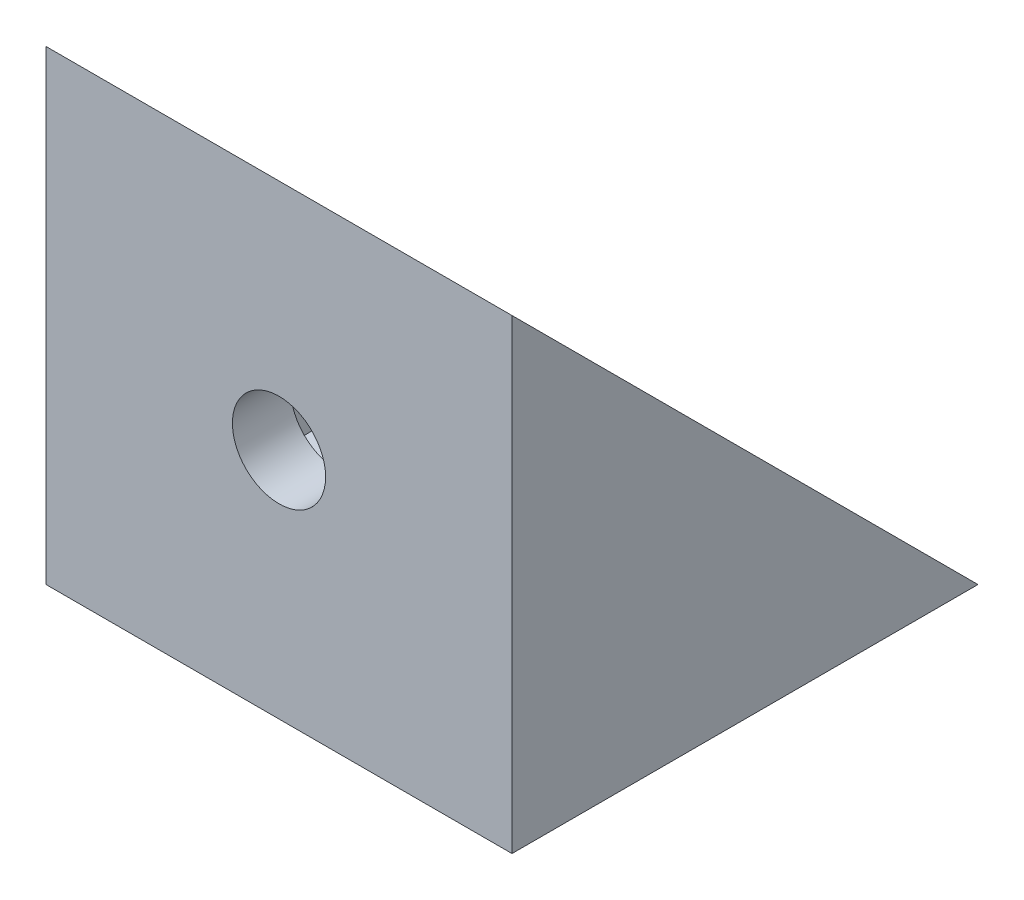
ISO-10303-21;
HEADER;
FILE_DESCRIPTION(('STEP AP214'),'2;1');
FILE_NAME('part.step','',(''),(''),'','','');
FILE_SCHEMA(('AUTOMOTIVE_DESIGN { 1 0 10303 214 1 1 1 1 }'));
ENDSEC;
DATA;
#1=APPLICATION_CONTEXT('core data for automotive mechanical design processes');
#2=APPLICATION_PROTOCOL_DEFINITION('international standard','automotive_design',2000,#1);
#3=PRODUCT_CONTEXT('',#1,'mechanical');
#4=PRODUCT('Part','Part','',(#3));
#5=PRODUCT_RELATED_PRODUCT_CATEGORY('part','',(#4));
#6=PRODUCT_DEFINITION_FORMATION('','',#4);
#7=PRODUCT_DEFINITION_CONTEXT('part definition',#1,'design');
#8=PRODUCT_DEFINITION('design','',#6,#7);
#9=PRODUCT_DEFINITION_SHAPE('','',#8);
#10=(LENGTH_UNIT() NAMED_UNIT(*) SI_UNIT(.MILLI.,.METRE.));
#11=(NAMED_UNIT(*) PLANE_ANGLE_UNIT() SI_UNIT($,.RADIAN.));
#12=(NAMED_UNIT(*) SI_UNIT($,.STERADIAN.) SOLID_ANGLE_UNIT());
#13=UNCERTAINTY_MEASURE_WITH_UNIT(LENGTH_MEASURE(1.E-05),#10,'distance_accuracy_value','');
#14=(GEOMETRIC_REPRESENTATION_CONTEXT(3) GLOBAL_UNCERTAINTY_ASSIGNED_CONTEXT((#13)) GLOBAL_UNIT_ASSIGNED_CONTEXT((#10,
#11,#12)) REPRESENTATION_CONTEXT('',''));
#15=CARTESIAN_POINT('',(0.,0.,0.));
#16=DIRECTION('',(0.,0.,1.));
#17=DIRECTION('',(1.,0.,0.));
#18=AXIS2_PLACEMENT_3D('',#15,#16,#17);
#19=CARTESIAN_POINT('',(-20.,0.,-40.));
#20=DIRECTION('',(0.,-1.,0.));
#21=DIRECTION('',(0.,0.,-1.));
#22=AXIS2_PLACEMENT_3D('',#19,#20,#21);
#23=PLANE('',#22);
#24=CARTESIAN_POINT('',(0.,0.,-20.));
#25=DIRECTION('',(0.,-1.,0.));
#26=DIRECTION('',(0.,0.,-1.));
#27=AXIS2_PLACEMENT_3D('',#24,#25,#26);
#28=CIRCLE('',#27,4.);
#29=CARTESIAN_POINT('',(0.,0.,-24.));
#30=VERTEX_POINT('',#29);
#31=EDGE_CURVE('E154',#30,#30,#28,.T.);
#32=ORIENTED_EDGE('',*,*,#31,.F.);
#33=EDGE_LOOP('',(#32));
#34=FACE_BOUND('',#33,.T.);
#35=DIRECTION('',(1.,0.,0.));
#36=VECTOR('',#35,1.);
#37=CARTESIAN_POINT('',(-20.,0.,-40.));
#38=LINE('',#37,#36);
#39=CARTESIAN_POINT('',(-20.,0.,-40.));
#40=VERTEX_POINT('',#39);
#41=CARTESIAN_POINT('',(20.,0.,-40.));
#42=VERTEX_POINT('',#41);
#43=EDGE_CURVE('E37',#40,#42,#38,.T.);
#44=ORIENTED_EDGE('',*,*,#43,.T.);
#45=DIRECTION('',(0.,0.,-1.));
#46=VECTOR('',#45,1.);
#47=CARTESIAN_POINT('',(20.,0.,-40.));
#48=LINE('',#47,#46);
#49=CARTESIAN_POINT('',(20.,0.,0.));
#50=VERTEX_POINT('',#49);
#51=EDGE_CURVE('E107',#50,#42,#48,.T.);
#52=ORIENTED_EDGE('',*,*,#51,.F.);
#53=DIRECTION('',(1.,0.,0.));
#54=VECTOR('',#53,1.);
#55=CARTESIAN_POINT('',(-20.,0.,0.));
#56=LINE('',#55,#54);
#57=CARTESIAN_POINT('',(-20.,0.,0.));
#58=VERTEX_POINT('',#57);
#59=EDGE_CURVE('E11',#58,#50,#56,.T.);
#60=ORIENTED_EDGE('',*,*,#59,.F.);
#61=DIRECTION('',(0.,0.,-1.));
#62=VECTOR('',#61,1.);
#63=CARTESIAN_POINT('',(-20.,0.,-40.));
#64=LINE('',#63,#62);
#65=EDGE_CURVE('E121',#58,#40,#64,.T.);
#66=ORIENTED_EDGE('',*,*,#65,.T.);
#67=EDGE_LOOP('',(#44,#52,#60,#66));
#68=FACE_BOUND('',#67,.T.);
#69=ADVANCED_FACE('F34',(#34,#68),#23,.T.);
#70=CARTESIAN_POINT('',(-20.,0.,0.));
#71=DIRECTION('',(0.,0.,1.));
#72=DIRECTION('',(1.,0.,0.));
#73=AXIS2_PLACEMENT_3D('',#70,#71,#72);
#74=PLANE('',#73);
#75=CARTESIAN_POINT('',(0.,20.,0.));
#76=DIRECTION('',(0.,0.,1.));
#77=DIRECTION('',(1.,0.,0.));
#78=AXIS2_PLACEMENT_3D('',#75,#76,#77);
#79=CIRCLE('',#78,4.);
#80=CARTESIAN_POINT('',(4.,20.,0.));
#81=VERTEX_POINT('',#80);
#82=EDGE_CURVE('E101',#81,#81,#79,.T.);
#83=ORIENTED_EDGE('',*,*,#82,.F.);
#84=EDGE_LOOP('',(#83));
#85=FACE_BOUND('',#84,.T.);
#86=ORIENTED_EDGE('',*,*,#59,.T.);
#87=DIRECTION('',(0.,-1.,0.));
#88=VECTOR('',#87,1.);
#89=CARTESIAN_POINT('',(20.,0.,0.));
#90=LINE('',#89,#88);
#91=CARTESIAN_POINT('',(20.,40.,0.));
#92=VERTEX_POINT('',#91);
#93=EDGE_CURVE('E118',#92,#50,#90,.T.);
#94=ORIENTED_EDGE('',*,*,#93,.F.);
#95=DIRECTION('',(1.,0.,0.));
#96=VECTOR('',#95,1.);
#97=CARTESIAN_POINT('',(-20.,40.,0.));
#98=LINE('',#97,#96);
#99=CARTESIAN_POINT('',(-20.,40.,0.));
#100=VERTEX_POINT('',#99);
#101=EDGE_CURVE('E42',#100,#92,#98,.T.);
#102=ORIENTED_EDGE('',*,*,#101,.F.);
#103=DIRECTION('',(0.,-1.,0.));
#104=VECTOR('',#103,1.);
#105=CARTESIAN_POINT('',(-20.,0.,0.));
#106=LINE('',#105,#104);
#107=EDGE_CURVE('E126',#100,#58,#106,.T.);
#108=ORIENTED_EDGE('',*,*,#107,.T.);
#109=EDGE_LOOP('',(#86,#94,#102,#108));
#110=FACE_BOUND('',#109,.T.);
#111=ADVANCED_FACE('F134',(#85,#110),#74,.T.);
#112=CARTESIAN_POINT('',(-20.,40.,0.));
#113=DIRECTION('',(0.,0.707106781186548,-0.707106781186548));
#114=DIRECTION('',(0.,0.707106781186548,0.707106781186548));
#115=AXIS2_PLACEMENT_3D('',#112,#113,#114);
#116=PLANE('',#115);
#117=DIRECTION('',(0.,0.707106781186547,0.707106781186547));
#118=VECTOR('',#117,1.);
#119=CARTESIAN_POINT('',(15.,5.,-35.));
#120=LINE('',#119,#118);
#121=CARTESIAN_POINT('',(15.,5.,-35.));
#122=VERTEX_POINT('',#121);
#123=CARTESIAN_POINT('',(15.,35.,-5.));
#124=VERTEX_POINT('',#123);
#125=EDGE_CURVE('E106',#122,#124,#120,.T.);
#126=ORIENTED_EDGE('',*,*,#125,.T.);
#127=DIRECTION('',(-1.,0.,0.));
#128=VECTOR('',#127,1.);
#129=CARTESIAN_POINT('',(15.,35.,-5.));
#130=LINE('',#129,#128);
#131=CARTESIAN_POINT('',(-15.,35.,-5.));
#132=VERTEX_POINT('',#131);
#133=EDGE_CURVE('E91',#124,#132,#130,.T.);
#134=ORIENTED_EDGE('',*,*,#133,.T.);
#135=DIRECTION('',(0.,0.707106781186547,0.707106781186547));
#136=VECTOR('',#135,1.);
#137=CARTESIAN_POINT('',(-15.,5.,-35.));
#138=LINE('',#137,#136);
#139=CARTESIAN_POINT('',(-15.,5.,-35.));
#140=VERTEX_POINT('',#139);
#141=EDGE_CURVE('E95',#140,#132,#138,.T.);
#142=ORIENTED_EDGE('',*,*,#141,.F.);
#143=DIRECTION('',(-1.,0.,0.));
#144=VECTOR('',#143,1.);
#145=CARTESIAN_POINT('',(15.,5.,-35.));
#146=LINE('',#145,#144);
#147=EDGE_CURVE('E112',#122,#140,#146,.T.);
#148=ORIENTED_EDGE('',*,*,#147,.F.);
#149=EDGE_LOOP('',(#126,#134,#142,#148));
#150=FACE_BOUND('',#149,.T.);
#151=ORIENTED_EDGE('',*,*,#101,.T.);
#152=DIRECTION('',(0.,0.707106781186548,0.707106781186548));
#153=VECTOR('',#152,1.);
#154=CARTESIAN_POINT('',(20.,40.,0.));
#155=LINE('',#154,#153);
#156=EDGE_CURVE('E110',#42,#92,#155,.T.);
#157=ORIENTED_EDGE('',*,*,#156,.F.);
#158=ORIENTED_EDGE('',*,*,#43,.F.);
#159=DIRECTION('',(0.,0.707106781186548,0.707106781186548));
#160=VECTOR('',#159,1.);
#161=CARTESIAN_POINT('',(-20.,40.,0.));
#162=LINE('',#161,#160);
#163=EDGE_CURVE('E123',#40,#100,#162,.T.);
#164=ORIENTED_EDGE('',*,*,#163,.T.);
#165=EDGE_LOOP('',(#151,#157,#158,#164));
#166=FACE_BOUND('',#165,.T.);
#167=ADVANCED_FACE('F103',(#150,#166),#116,.T.);
#168=CARTESIAN_POINT('',(-20.,0.,0.));
#169=DIRECTION('',(-1.,0.,0.));
#170=DIRECTION('',(0.,0.,1.));
#171=AXIS2_PLACEMENT_3D('',#168,#169,#170);
#172=PLANE('',#171);
#173=ORIENTED_EDGE('',*,*,#65,.F.);
#174=ORIENTED_EDGE('',*,*,#107,.F.);
#175=ORIENTED_EDGE('',*,*,#163,.F.);
#176=EDGE_LOOP('',(#173,#174,#175));
#177=FACE_BOUND('',#176,.T.);
#178=ADVANCED_FACE('F137',(#177),#172,.T.);
#179=CARTESIAN_POINT('',(20.,0.,0.));
#180=DIRECTION('',(-1.,0.,0.));
#181=DIRECTION('',(0.,0.,1.));
#182=AXIS2_PLACEMENT_3D('',#179,#180,#181);
#183=PLANE('',#182);
#184=ORIENTED_EDGE('',*,*,#51,.T.);
#185=ORIENTED_EDGE('',*,*,#156,.T.);
#186=ORIENTED_EDGE('',*,*,#93,.T.);
#187=EDGE_LOOP('',(#184,#185,#186));
#188=FACE_BOUND('',#187,.T.);
#189=ADVANCED_FACE('F132',(#188),#183,.F.);
#190=CARTESIAN_POINT('',(15.,35.,-5.));
#191=DIRECTION('',(0.,0.,-1.));
#192=DIRECTION('',(0.,1.,0.));
#193=AXIS2_PLACEMENT_3D('',#190,#191,#192);
#194=PLANE('',#193);
#195=CARTESIAN_POINT('',(0.,20.,-5.));
#196=DIRECTION('',(0.,0.,-1.));
#197=DIRECTION('',(0.,1.,0.));
#198=AXIS2_PLACEMENT_3D('',#195,#196,#197);
#199=CIRCLE('',#198,4.);
#200=CARTESIAN_POINT('',(0.,24.,-5.));
#201=VERTEX_POINT('',#200);
#202=EDGE_CURVE('E156',#201,#201,#199,.F.);
#203=ORIENTED_EDGE('',*,*,#202,.T.);
#204=EDGE_LOOP('',(#203));
#205=FACE_BOUND('',#204,.T.);
#206=ORIENTED_EDGE('',*,*,#133,.F.);
#207=DIRECTION('',(0.,-1.,0.));
#208=VECTOR('',#207,1.);
#209=CARTESIAN_POINT('',(15.,35.,-5.));
#210=LINE('',#209,#208);
#211=CARTESIAN_POINT('',(15.,5.,-5.));
#212=VERTEX_POINT('',#211);
#213=EDGE_CURVE('E168',#124,#212,#210,.T.);
#214=ORIENTED_EDGE('',*,*,#213,.T.);
#215=DIRECTION('',(-1.,0.,0.));
#216=VECTOR('',#215,1.);
#217=CARTESIAN_POINT('',(15.,5.,-5.));
#218=LINE('',#217,#216);
#219=CARTESIAN_POINT('',(-15.,5.,-5.));
#220=VERTEX_POINT('',#219);
#221=EDGE_CURVE('E94',#212,#220,#218,.T.);
#222=ORIENTED_EDGE('',*,*,#221,.T.);
#223=DIRECTION('',(0.,-1.,0.));
#224=VECTOR('',#223,1.);
#225=CARTESIAN_POINT('',(-15.,35.,-5.));
#226=LINE('',#225,#224);
#227=EDGE_CURVE('E88',#132,#220,#226,.T.);
#228=ORIENTED_EDGE('',*,*,#227,.F.);
#229=EDGE_LOOP('',(#206,#214,#222,#228));
#230=FACE_BOUND('',#229,.T.);
#231=ADVANCED_FACE('F89',(#205,#230),#194,.T.);
#232=CARTESIAN_POINT('',(15.,5.,-5.));
#233=DIRECTION('',(0.,1.,0.));
#234=DIRECTION('',(0.,0.,1.));
#235=AXIS2_PLACEMENT_3D('',#232,#233,#234);
#236=PLANE('',#235);
#237=CARTESIAN_POINT('',(0.,5.,-20.));
#238=DIRECTION('',(0.,1.,0.));
#239=DIRECTION('',(0.,0.,1.));
#240=AXIS2_PLACEMENT_3D('',#237,#238,#239);
#241=CIRCLE('',#240,4.);
#242=CARTESIAN_POINT('',(0.,5.,-16.));
#243=VERTEX_POINT('',#242);
#244=EDGE_CURVE('E157',#243,#243,#241,.F.);
#245=ORIENTED_EDGE('',*,*,#244,.T.);
#246=EDGE_LOOP('',(#245));
#247=FACE_BOUND('',#246,.T.);
#248=ORIENTED_EDGE('',*,*,#221,.F.);
#249=DIRECTION('',(0.,0.,-1.));
#250=VECTOR('',#249,1.);
#251=CARTESIAN_POINT('',(15.,5.,-5.));
#252=LINE('',#251,#250);
#253=EDGE_CURVE('E170',#212,#122,#252,.T.);
#254=ORIENTED_EDGE('',*,*,#253,.T.);
#255=ORIENTED_EDGE('',*,*,#147,.T.);
#256=DIRECTION('',(0.,0.,-1.));
#257=VECTOR('',#256,1.);
#258=CARTESIAN_POINT('',(-15.,5.,-5.));
#259=LINE('',#258,#257);
#260=EDGE_CURVE('E50',#220,#140,#259,.T.);
#261=ORIENTED_EDGE('',*,*,#260,.F.);
#262=EDGE_LOOP('',(#248,#254,#255,#261));
#263=FACE_BOUND('',#262,.T.);
#264=ADVANCED_FACE('F172',(#247,#263),#236,.T.);
#265=CARTESIAN_POINT('',(15.,0.,0.));
#266=DIRECTION('',(1.,0.,0.));
#267=DIRECTION('',(0.,0.,-1.));
#268=AXIS2_PLACEMENT_3D('',#265,#266,#267);
#269=PLANE('',#268);
#270=ORIENTED_EDGE('',*,*,#125,.F.);
#271=ORIENTED_EDGE('',*,*,#253,.F.);
#272=ORIENTED_EDGE('',*,*,#213,.F.);
#273=EDGE_LOOP('',(#270,#271,#272));
#274=FACE_BOUND('',#273,.T.);
#275=ADVANCED_FACE('F175',(#274),#269,.F.);
#276=CARTESIAN_POINT('',(-15.,0.,0.));
#277=DIRECTION('',(1.,0.,0.));
#278=DIRECTION('',(0.,0.,-1.));
#279=AXIS2_PLACEMENT_3D('',#276,#277,#278);
#280=PLANE('',#279);
#281=ORIENTED_EDGE('',*,*,#141,.T.);
#282=ORIENTED_EDGE('',*,*,#227,.T.);
#283=ORIENTED_EDGE('',*,*,#260,.T.);
#284=EDGE_LOOP('',(#281,#282,#283));
#285=FACE_BOUND('',#284,.T.);
#286=ADVANCED_FACE('F98',(#285),#280,.T.);
#287=CARTESIAN_POINT('',(0.,20.,-40.001));
#288=DIRECTION('',(0.,0.,1.));
#289=DIRECTION('',(1.,0.,0.));
#290=AXIS2_PLACEMENT_3D('',#287,#288,#289);
#291=CYLINDRICAL_SURFACE('',#290,4.);
#292=ORIENTED_EDGE('',*,*,#202,.F.);
#293=EDGE_LOOP('',(#292));
#294=FACE_BOUND('',#293,.T.);
#295=ORIENTED_EDGE('',*,*,#82,.T.);
#296=EDGE_LOOP('',(#295));
#297=FACE_BOUND('',#296,.T.);
#298=ADVANCED_FACE('F182',(#294,#297),#291,.F.);
#299=CARTESIAN_POINT('',(0.,40.001,-20.));
#300=DIRECTION('',(0.,-1.,0.));
#301=DIRECTION('',(0.,0.,-1.));
#302=AXIS2_PLACEMENT_3D('',#299,#300,#301);
#303=CYLINDRICAL_SURFACE('',#302,4.);
#304=ORIENTED_EDGE('',*,*,#244,.F.);
#305=EDGE_LOOP('',(#304));
#306=FACE_BOUND('',#305,.T.);
#307=ORIENTED_EDGE('',*,*,#31,.T.);
#308=EDGE_LOOP('',(#307));
#309=FACE_BOUND('',#308,.T.);
#310=ADVANCED_FACE('F196',(#306,#309),#303,.F.);
#311=CLOSED_SHELL('',(#69,#111,#167,#178,#189,#231,#264,#275,#286,#298,#310));
#312=MANIFOLD_SOLID_BREP('B2',#311);
#313=ADVANCED_BREP_SHAPE_REPRESENTATION('',(#18,#312),#14);
#314=SHAPE_DEFINITION_REPRESENTATION(#9,#313);
ENDSEC;
END-ISO-10303-21;
